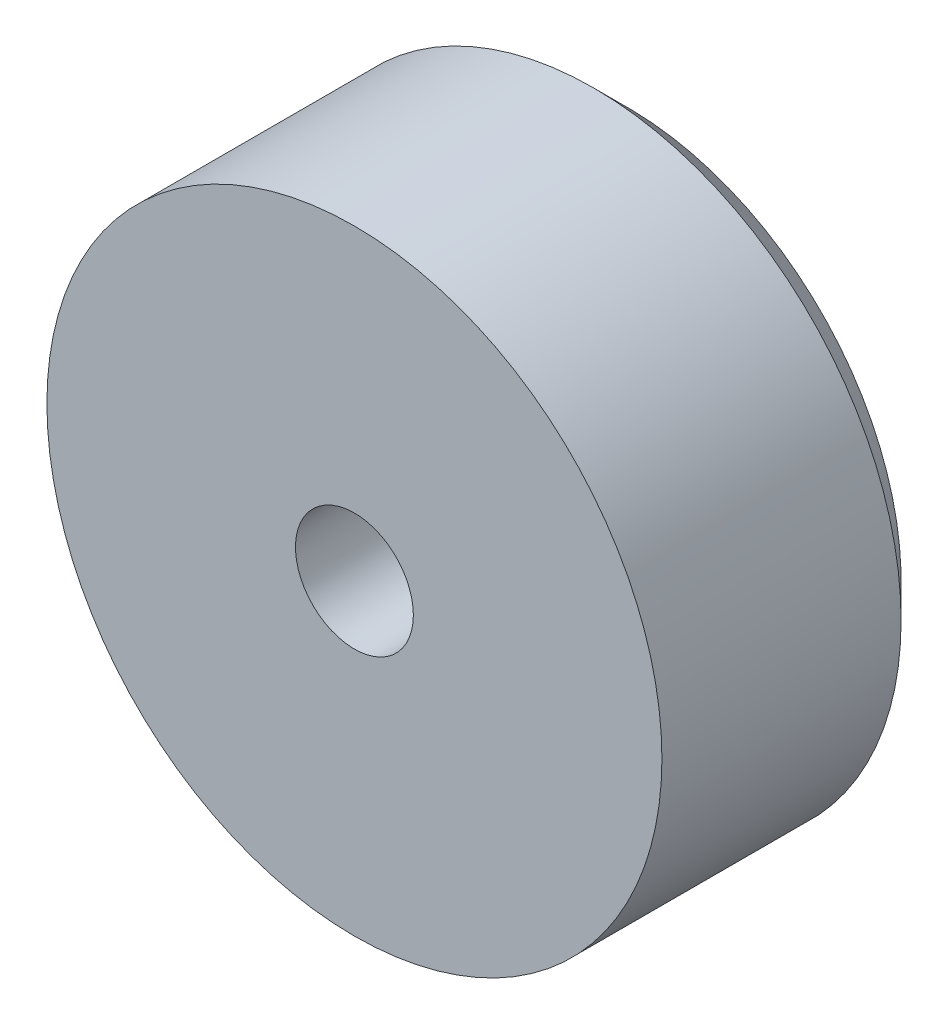
ISO-10303-21;
HEADER;
FILE_DESCRIPTION(('STEP AP214'),'2;1');
FILE_NAME('part.step','',(''),(''),'','','');
FILE_SCHEMA(('AUTOMOTIVE_DESIGN { 1 0 10303 214 1 1 1 1 }'));
ENDSEC;
DATA;
#1=APPLICATION_CONTEXT('core data for automotive mechanical design processes');
#2=APPLICATION_PROTOCOL_DEFINITION('international standard','automotive_design',2000,#1);
#3=PRODUCT_CONTEXT('',#1,'mechanical');
#4=PRODUCT('Part','Part','',(#3));
#5=PRODUCT_RELATED_PRODUCT_CATEGORY('part','',(#4));
#6=PRODUCT_DEFINITION_FORMATION('','',#4);
#7=PRODUCT_DEFINITION_CONTEXT('part definition',#1,'design');
#8=PRODUCT_DEFINITION('design','',#6,#7);
#9=PRODUCT_DEFINITION_SHAPE('','',#8);
#10=(LENGTH_UNIT() NAMED_UNIT(*) SI_UNIT(.MILLI.,.METRE.));
#11=(NAMED_UNIT(*) PLANE_ANGLE_UNIT() SI_UNIT($,.RADIAN.));
#12=(NAMED_UNIT(*) SI_UNIT($,.STERADIAN.) SOLID_ANGLE_UNIT());
#13=UNCERTAINTY_MEASURE_WITH_UNIT(LENGTH_MEASURE(1.E-05),#10,'distance_accuracy_value','');
#14=(GEOMETRIC_REPRESENTATION_CONTEXT(3) GLOBAL_UNCERTAINTY_ASSIGNED_CONTEXT((#13)) GLOBAL_UNIT_ASSIGNED_CONTEXT((#10,
#11,#12)) REPRESENTATION_CONTEXT('',''));
#15=CARTESIAN_POINT('',(0.,0.,0.));
#16=DIRECTION('',(0.,0.,1.));
#17=DIRECTION('',(1.,0.,0.));
#18=AXIS2_PLACEMENT_3D('',#15,#16,#17);
#19=CARTESIAN_POINT('',(-331.475088035676,-38.7751455127787,165.299917054176));
#20=DIRECTION('',(0.,0.,1.));
#21=DIRECTION('',(-1.,0.,0.));
#22=AXIS2_PLACEMENT_3D('',#19,#20,#21);
#23=CONICAL_SURFACE('',#22,8.5,0.785398163397447);
#24=CARTESIAN_POINT('',(-331.475088035676,-38.7751455127787,165.799917054176));
#25=DIRECTION('',(0.,0.,-1.));
#26=DIRECTION('',(-1.,0.,0.));
#27=AXIS2_PLACEMENT_3D('',#24,#25,#26);
#28=CIRCLE('',#27,9.);
#29=CARTESIAN_POINT('',(-340.475088035676,-38.7751455127787,165.799917054176));
#30=VERTEX_POINT('',#29);
#31=EDGE_CURVE('E10',#30,#30,#28,.T.);
#32=ORIENTED_EDGE('',*,*,#31,.T.);
#33=EDGE_LOOP('',(#32));
#34=FACE_BOUND('',#33,.T.);
#35=CARTESIAN_POINT('',(-331.475088035676,-38.7751455127787,164.799917054176));
#36=DIRECTION('',(0.,0.,1.));
#37=DIRECTION('',(-1.,0.,0.));
#38=AXIS2_PLACEMENT_3D('',#35,#36,#37);
#39=CIRCLE('',#38,8.);
#40=CARTESIAN_POINT('',(-339.475088035676,-38.7751455127787,164.799917054176));
#41=VERTEX_POINT('',#40);
#42=EDGE_CURVE('E22',#41,#41,#39,.T.);
#43=ORIENTED_EDGE('',*,*,#42,.T.);
#44=EDGE_LOOP('',(#43));
#45=FACE_BOUND('',#44,.T.);
#46=ADVANCED_FACE('F14',(#34,#45),#23,.T.);
#47=CARTESIAN_POINT('',(-331.475088035676,-38.7751455127787,168.799917054176));
#48=DIRECTION('',(0.,0.,-1.));
#49=DIRECTION('',(1.,0.,0.));
#50=AXIS2_PLACEMENT_3D('',#47,#48,#49);
#51=CYLINDRICAL_SURFACE('',#50,9.);
#52=CARTESIAN_POINT('',(-331.475088035676,-38.7751455127787,172.799917054176));
#53=DIRECTION('',(0.,0.,1.));
#54=DIRECTION('',(1.,0.,0.));
#55=AXIS2_PLACEMENT_3D('',#52,#53,#54);
#56=CIRCLE('',#55,9.);
#57=CARTESIAN_POINT('',(-322.475088035676,-38.7751455127787,172.799917054176));
#58=VERTEX_POINT('',#57);
#59=EDGE_CURVE('E30',#58,#58,#56,.T.);
#60=ORIENTED_EDGE('',*,*,#59,.F.);
#61=EDGE_LOOP('',(#60));
#62=FACE_BOUND('',#61,.T.);
#63=ORIENTED_EDGE('',*,*,#31,.F.);
#64=EDGE_LOOP('',(#63));
#65=FACE_BOUND('',#64,.T.);
#66=ADVANCED_FACE('F58',(#62,#65),#51,.T.);
#67=CARTESIAN_POINT('',(-331.475088035676,-38.7751455127787,164.799917054176));
#68=DIRECTION('',(0.,0.,-1.));
#69=DIRECTION('',(1.,0.,0.));
#70=AXIS2_PLACEMENT_3D('',#67,#68,#69);
#71=PLANE('',#70);
#72=CARTESIAN_POINT('',(-331.475088035676,-38.7751455127787,164.799917054176));
#73=DIRECTION('',(0.,0.,1.));
#74=DIRECTION('',(1.,0.,0.));
#75=AXIS2_PLACEMENT_3D('',#72,#73,#74);
#76=CIRCLE('',#75,3.);
#77=CARTESIAN_POINT('',(-328.475088035676,-38.7751455127787,164.799917054176));
#78=VERTEX_POINT('',#77);
#79=EDGE_CURVE('E27',#78,#78,#76,.T.);
#80=ORIENTED_EDGE('',*,*,#79,.T.);
#81=EDGE_LOOP('',(#80));
#82=FACE_BOUND('',#81,.T.);
#83=ORIENTED_EDGE('',*,*,#42,.F.);
#84=EDGE_LOOP('',(#83));
#85=FACE_BOUND('',#84,.T.);
#86=ADVANCED_FACE('F63',(#82,#85),#71,.T.);
#87=CARTESIAN_POINT('',(-331.475088035676,-38.7751455127787,168.799917054176));
#88=DIRECTION('',(0.,0.,1.));
#89=DIRECTION('',(-1.,0.,0.));
#90=AXIS2_PLACEMENT_3D('',#87,#88,#89);
#91=PLANE('',#90);
#92=CARTESIAN_POINT('',(-331.475088035676,-38.7751455127787,168.799917054176));
#93=DIRECTION('',(0.,0.,1.));
#94=DIRECTION('',(1.,0.,0.));
#95=AXIS2_PLACEMENT_3D('',#92,#93,#94);
#96=CIRCLE('',#95,3.);
#97=CARTESIAN_POINT('',(-328.475088035676,-38.7751455127787,168.799917054176));
#98=VERTEX_POINT('',#97);
#99=EDGE_CURVE('E35',#98,#98,#96,.T.);
#100=ORIENTED_EDGE('',*,*,#99,.F.);
#101=EDGE_LOOP('',(#100));
#102=FACE_BOUND('',#101,.T.);
#103=CARTESIAN_POINT('',(-331.475088035676,-38.7751455127787,168.799917054176));
#104=DIRECTION('',(0.,0.,-1.));
#105=DIRECTION('',(1.,0.,0.));
#106=AXIS2_PLACEMENT_3D('',#103,#104,#105);
#107=CIRCLE('',#106,1.725);
#108=CARTESIAN_POINT('',(-329.750088035676,-38.7751455127787,168.799917054176));
#109=VERTEX_POINT('',#108);
#110=EDGE_CURVE('E37',#109,#109,#107,.T.);
#111=ORIENTED_EDGE('',*,*,#110,.F.);
#112=EDGE_LOOP('',(#111));
#113=FACE_BOUND('',#112,.T.);
#114=ADVANCED_FACE('F54',(#102,#113),#91,.F.);
#115=CARTESIAN_POINT('',(-331.475088035676,-38.7751455127787,161.299916815758));
#116=DIRECTION('',(0.,0.,-1.));
#117=DIRECTION('',(1.,0.,0.));
#118=AXIS2_PLACEMENT_3D('',#115,#116,#117);
#119=CYLINDRICAL_SURFACE('',#118,3.);
#120=ORIENTED_EDGE('',*,*,#79,.F.);
#121=EDGE_LOOP('',(#120));
#122=FACE_BOUND('',#121,.T.);
#123=ORIENTED_EDGE('',*,*,#99,.T.);
#124=EDGE_LOOP('',(#123));
#125=FACE_BOUND('',#124,.T.);
#126=ADVANCED_FACE('F48',(#122,#125),#119,.F.);
#127=CARTESIAN_POINT('',(-331.475088035676,-38.7751455127787,173.299916934967));
#128=DIRECTION('',(0.,0.,-1.));
#129=DIRECTION('',(1.,0.,0.));
#130=AXIS2_PLACEMENT_3D('',#127,#128,#129);
#131=CYLINDRICAL_SURFACE('',#130,1.725);
#132=CARTESIAN_POINT('',(-331.475088035676,-38.7751455127787,172.799917054176));
#133=DIRECTION('',(0.,0.,-1.));
#134=DIRECTION('',(1.,0.,0.));
#135=AXIS2_PLACEMENT_3D('',#132,#133,#134);
#136=CIRCLE('',#135,1.725);
#137=CARTESIAN_POINT('',(-329.750088035676,-38.7751455127787,172.799917054176));
#138=VERTEX_POINT('',#137);
#139=EDGE_CURVE('E18',#138,#138,#136,.T.);
#140=ORIENTED_EDGE('',*,*,#139,.F.);
#141=EDGE_LOOP('',(#140));
#142=FACE_BOUND('',#141,.T.);
#143=ORIENTED_EDGE('',*,*,#110,.T.);
#144=EDGE_LOOP('',(#143));
#145=FACE_BOUND('',#144,.T.);
#146=ADVANCED_FACE('F46',(#142,#145),#131,.F.);
#147=CARTESIAN_POINT('',(-331.475088035676,-38.7751455127787,172.799917054176));
#148=DIRECTION('',(0.,0.,1.));
#149=DIRECTION('',(-1.,0.,0.));
#150=AXIS2_PLACEMENT_3D('',#147,#148,#149);
#151=PLANE('',#150);
#152=ORIENTED_EDGE('',*,*,#139,.T.);
#153=EDGE_LOOP('',(#152));
#154=FACE_BOUND('',#153,.T.);
#155=ORIENTED_EDGE('',*,*,#59,.T.);
#156=EDGE_LOOP('',(#155));
#157=FACE_BOUND('',#156,.T.);
#158=ADVANCED_FACE('F16',(#154,#157),#151,.T.);
#159=CLOSED_SHELL('',(#46,#66,#86,#114,#126,#146,#158));
#160=MANIFOLD_SOLID_BREP('B1',#159);
#161=ADVANCED_BREP_SHAPE_REPRESENTATION('',(#18,#160),#14);
#162=SHAPE_DEFINITION_REPRESENTATION(#9,#161);
ENDSEC;
END-ISO-10303-21;
